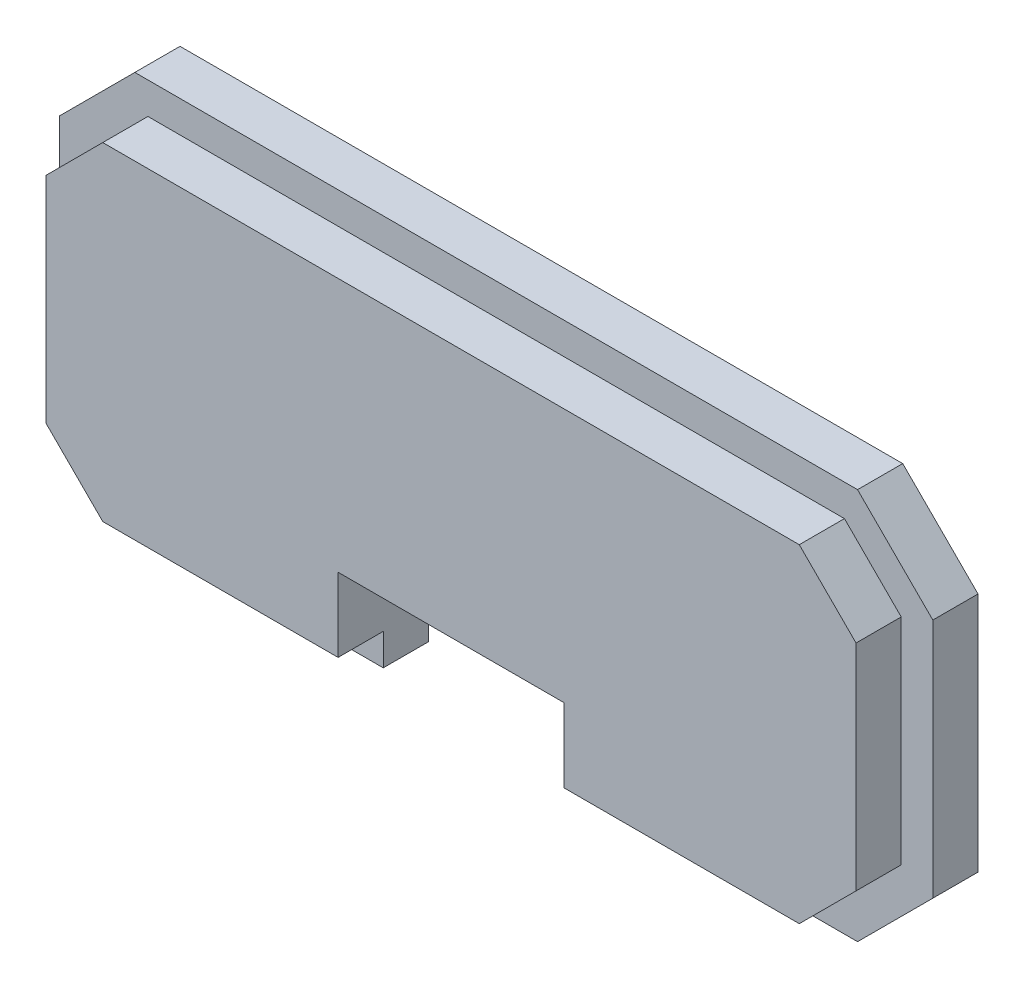
ISO-10303-21;
HEADER;
FILE_DESCRIPTION(('STEP AP214'),'2;1');
FILE_NAME('part.step','',(''),(''),'','','');
FILE_SCHEMA(('AUTOMOTIVE_DESIGN { 1 0 10303 214 1 1 1 1 }'));
ENDSEC;
DATA;
#1=APPLICATION_CONTEXT('core data for automotive mechanical design processes');
#2=APPLICATION_PROTOCOL_DEFINITION('international standard','automotive_design',2000,#1);
#3=PRODUCT_CONTEXT('',#1,'mechanical');
#4=PRODUCT('Part','Part','',(#3));
#5=PRODUCT_RELATED_PRODUCT_CATEGORY('part','',(#4));
#6=PRODUCT_DEFINITION_FORMATION('','',#4);
#7=PRODUCT_DEFINITION_CONTEXT('part definition',#1,'design');
#8=PRODUCT_DEFINITION('design','',#6,#7);
#9=PRODUCT_DEFINITION_SHAPE('','',#8);
#10=(LENGTH_UNIT() NAMED_UNIT(*) SI_UNIT(.MILLI.,.METRE.));
#11=(NAMED_UNIT(*) PLANE_ANGLE_UNIT() SI_UNIT($,.RADIAN.));
#12=(NAMED_UNIT(*) SI_UNIT($,.STERADIAN.) SOLID_ANGLE_UNIT());
#13=UNCERTAINTY_MEASURE_WITH_UNIT(LENGTH_MEASURE(1.E-05),#10,'distance_accuracy_value','');
#14=(GEOMETRIC_REPRESENTATION_CONTEXT(3) GLOBAL_UNCERTAINTY_ASSIGNED_CONTEXT((#13)) GLOBAL_UNIT_ASSIGNED_CONTEXT((#10,
#11,#12)) REPRESENTATION_CONTEXT('',''));
#15=CARTESIAN_POINT('',(0.,0.,0.));
#16=DIRECTION('',(0.,0.,1.));
#17=DIRECTION('',(1.,0.,0.));
#18=AXIS2_PLACEMENT_3D('',#15,#16,#17);
#19=CARTESIAN_POINT('',(-179.020441826215,80.6096612665685,3.));
#20=DIRECTION('',(0.,1.,0.));
#21=DIRECTION('',(0.,0.,1.));
#22=AXIS2_PLACEMENT_3D('',#19,#20,#21);
#23=PLANE('',#22);
#24=DIRECTION('',(0.,0.,-1.));
#25=VECTOR('',#24,1.);
#26=CARTESIAN_POINT('',(-210.520441826215,80.6096612665685,6.));
#27=LINE('',#26,#25);
#28=CARTESIAN_POINT('',(-210.520441826215,80.6096612665685,3.));
#29=VERTEX_POINT('',#28);
#30=CARTESIAN_POINT('',(-210.520441826215,80.6096612665685,0.));
#31=VERTEX_POINT('',#30);
#32=EDGE_CURVE('E226',#29,#31,#27,.T.);
#33=ORIENTED_EDGE('',*,*,#32,.F.);
#34=DIRECTION('',(1.,0.,0.));
#35=VECTOR('',#34,1.);
#36=CARTESIAN_POINT('',(-179.020441826215,80.6096612665685,3.));
#37=LINE('',#36,#35);
#38=CARTESIAN_POINT('',(-227.020441826215,80.6096612665685,3.));
#39=VERTEX_POINT('',#38);
#40=EDGE_CURVE('E308',#39,#29,#37,.T.);
#41=ORIENTED_EDGE('',*,*,#40,.F.);
#42=DIRECTION('',(0.,0.,-1.));
#43=VECTOR('',#42,1.);
#44=CARTESIAN_POINT('',(-227.020441826215,80.6096612665685,3.));
#45=LINE('',#44,#43);
#46=CARTESIAN_POINT('',(-227.020441826215,80.6096612665685,0.));
#47=VERTEX_POINT('',#46);
#48=EDGE_CURVE('E217',#39,#47,#45,.T.);
#49=ORIENTED_EDGE('',*,*,#48,.T.);
#50=DIRECTION('',(1.,0.,0.));
#51=VECTOR('',#50,1.);
#52=CARTESIAN_POINT('',(-179.020441826215,80.6096612665685,0.));
#53=LINE('',#52,#51);
#54=EDGE_CURVE('E324',#47,#31,#53,.T.);
#55=ORIENTED_EDGE('',*,*,#54,.T.);
#56=EDGE_LOOP('',(#33,#41,#49,#55));
#57=FACE_BOUND('',#56,.T.);
#58=ADVANCED_FACE('F43',(#57),#23,.F.);
#59=CARTESIAN_POINT('',(0.,0.,3.));
#60=DIRECTION('',(0.,0.,1.));
#61=DIRECTION('',(1.,0.,0.));
#62=AXIS2_PLACEMENT_3D('',#59,#60,#61);
#63=PLANE('',#62);
#64=ORIENTED_EDGE('',*,*,#40,.T.);
#65=DIRECTION('',(0.,1.,0.));
#66=VECTOR('',#65,1.);
#67=CARTESIAN_POINT('',(-210.520441826215,0.,3.));
#68=LINE('',#67,#66);
#69=CARTESIAN_POINT('',(-210.520441826215,82.7096612665685,3.));
#70=VERTEX_POINT('',#69);
#71=EDGE_CURVE('E235',#29,#70,#68,.T.);
#72=ORIENTED_EDGE('',*,*,#71,.T.);
#73=DIRECTION('',(1.,0.,0.));
#74=VECTOR('',#73,1.);
#75=CARTESIAN_POINT('',(-226.150593345232,82.7096612665685,3.));
#76=LINE('',#75,#74);
#77=CARTESIAN_POINT('',(-226.150593345232,82.7096612665685,3.));
#78=VERTEX_POINT('',#77);
#79=EDGE_CURVE('E238',#78,#70,#76,.T.);
#80=ORIENTED_EDGE('',*,*,#79,.F.);
#81=DIRECTION('',(0.707106781186546,-0.707106781186549,0.));
#82=VECTOR('',#81,1.);
#83=CARTESIAN_POINT('',(-229.920441826215,86.479509747552,3.));
#84=LINE('',#83,#82);
#85=CARTESIAN_POINT('',(-229.920441826215,86.479509747552,3.));
#86=VERTEX_POINT('',#85);
#87=EDGE_CURVE('E275',#86,#78,#84,.T.);
#88=ORIENTED_EDGE('',*,*,#87,.F.);
#89=DIRECTION('',(0.,-1.,0.));
#90=VECTOR('',#89,1.);
#91=CARTESIAN_POINT('',(-229.920441826215,100.739812785585,3.));
#92=LINE('',#91,#90);
#93=CARTESIAN_POINT('',(-229.920441826215,100.739812785585,3.));
#94=VERTEX_POINT('',#93);
#95=EDGE_CURVE('E267',#94,#86,#92,.T.);
#96=ORIENTED_EDGE('',*,*,#95,.F.);
#97=DIRECTION('',(-0.707106781186551,-0.707106781186544,0.));
#98=VECTOR('',#97,1.);
#99=CARTESIAN_POINT('',(-226.150593345231,104.509661266568,3.));
#100=LINE('',#99,#98);
#101=CARTESIAN_POINT('',(-226.150593345231,104.509661266568,3.));
#102=VERTEX_POINT('',#101);
#103=EDGE_CURVE('E266',#102,#94,#100,.T.);
#104=ORIENTED_EDGE('',*,*,#103,.F.);
#105=DIRECTION('',(-1.,0.,0.));
#106=VECTOR('',#105,1.);
#107=CARTESIAN_POINT('',(-179.890290307199,104.509661266568,3.));
#108=LINE('',#107,#106);
#109=CARTESIAN_POINT('',(-179.890290307199,104.509661266568,3.));
#110=VERTEX_POINT('',#109);
#111=EDGE_CURVE('E263',#110,#102,#108,.T.);
#112=ORIENTED_EDGE('',*,*,#111,.F.);
#113=DIRECTION('',(-0.707106781186545,0.70710678118655,0.));
#114=VECTOR('',#113,1.);
#115=CARTESIAN_POINT('',(-176.120441826215,100.739812785585,3.));
#116=LINE('',#115,#114);
#117=CARTESIAN_POINT('',(-176.120441826215,100.739812785585,3.));
#118=VERTEX_POINT('',#117);
#119=EDGE_CURVE('E257',#118,#110,#116,.T.);
#120=ORIENTED_EDGE('',*,*,#119,.F.);
#121=DIRECTION('',(0.,1.,0.));
#122=VECTOR('',#121,1.);
#123=CARTESIAN_POINT('',(-176.120441826215,86.479509747552,3.));
#124=LINE('',#123,#122);
#125=CARTESIAN_POINT('',(-176.120441826215,86.479509747552,3.));
#126=VERTEX_POINT('',#125);
#127=EDGE_CURVE('E260',#126,#118,#124,.T.);
#128=ORIENTED_EDGE('',*,*,#127,.F.);
#129=DIRECTION('',(0.707106781186549,0.707106781186546,0.));
#130=VECTOR('',#129,1.);
#131=CARTESIAN_POINT('',(-179.890290307199,82.7096612665685,3.));
#132=LINE('',#131,#130);
#133=CARTESIAN_POINT('',(-179.890290307199,82.7096612665685,3.));
#134=VERTEX_POINT('',#133);
#135=EDGE_CURVE('E234',#134,#126,#132,.T.);
#136=ORIENTED_EDGE('',*,*,#135,.F.);
#137=CARTESIAN_POINT('',(-195.520441826215,82.7096612665685,3.));
#138=VERTEX_POINT('',#137);
#139=EDGE_CURVE('E66',#138,#134,#76,.T.);
#140=ORIENTED_EDGE('',*,*,#139,.F.);
#141=DIRECTION('',(0.,-1.,0.));
#142=VECTOR('',#141,1.);
#143=CARTESIAN_POINT('',(-195.520441826215,0.,3.));
#144=LINE('',#143,#142);
#145=CARTESIAN_POINT('',(-195.520441826215,80.6096612665685,3.));
#146=VERTEX_POINT('',#145);
#147=EDGE_CURVE('E228',#138,#146,#144,.T.);
#148=ORIENTED_EDGE('',*,*,#147,.T.);
#149=CARTESIAN_POINT('',(-179.020441826215,80.6096612665685,3.));
#150=VERTEX_POINT('',#149);
#151=EDGE_CURVE('E302',#146,#150,#37,.T.);
#152=ORIENTED_EDGE('',*,*,#151,.T.);
#153=DIRECTION('',(0.707106781186551,0.707106781186545,0.));
#154=VECTOR('',#153,1.);
#155=CARTESIAN_POINT('',(-179.020441826215,80.6096612665685,3.));
#156=LINE('',#155,#154);
#157=CARTESIAN_POINT('',(-174.020441826215,85.6096612665685,3.));
#158=VERTEX_POINT('',#157);
#159=EDGE_CURVE('E310',#150,#158,#156,.T.);
#160=ORIENTED_EDGE('',*,*,#159,.T.);
#161=DIRECTION('',(0.,1.,0.));
#162=VECTOR('',#161,1.);
#163=CARTESIAN_POINT('',(-174.020441826215,101.609661266568,3.));
#164=LINE('',#163,#162);
#165=CARTESIAN_POINT('',(-174.020441826215,101.609661266568,3.));
#166=VERTEX_POINT('',#165);
#167=EDGE_CURVE('E313',#158,#166,#164,.T.);
#168=ORIENTED_EDGE('',*,*,#167,.T.);
#169=DIRECTION('',(-0.707106781186545,0.707106781186549,0.));
#170=VECTOR('',#169,1.);
#171=CARTESIAN_POINT('',(-174.020441826215,101.609661266568,3.));
#172=LINE('',#171,#170);
#173=CARTESIAN_POINT('',(-179.020441826215,106.609661266568,3.));
#174=VERTEX_POINT('',#173);
#175=EDGE_CURVE('E311',#166,#174,#172,.T.);
#176=ORIENTED_EDGE('',*,*,#175,.T.);
#177=DIRECTION('',(-1.,0.,0.));
#178=VECTOR('',#177,1.);
#179=CARTESIAN_POINT('',(-227.020441826215,106.609661266568,3.));
#180=LINE('',#179,#178);
#181=CARTESIAN_POINT('',(-227.020441826215,106.609661266568,3.));
#182=VERTEX_POINT('',#181);
#183=EDGE_CURVE('E312',#174,#182,#180,.T.);
#184=ORIENTED_EDGE('',*,*,#183,.T.);
#185=DIRECTION('',(-0.707106781186549,-0.707106781186545,0.));
#186=VECTOR('',#185,1.);
#187=CARTESIAN_POINT('',(-227.020441826215,106.609661266568,3.));
#188=LINE('',#187,#186);
#189=CARTESIAN_POINT('',(-232.020441826215,101.609661266568,3.));
#190=VERTEX_POINT('',#189);
#191=EDGE_CURVE('E320',#182,#190,#188,.T.);
#192=ORIENTED_EDGE('',*,*,#191,.T.);
#193=DIRECTION('',(0.,-1.,0.));
#194=VECTOR('',#193,1.);
#195=CARTESIAN_POINT('',(-232.020441826215,85.6096612665685,3.));
#196=LINE('',#195,#194);
#197=CARTESIAN_POINT('',(-232.020441826215,85.6096612665685,3.));
#198=VERTEX_POINT('',#197);
#199=EDGE_CURVE('E317',#190,#198,#196,.T.);
#200=ORIENTED_EDGE('',*,*,#199,.T.);
#201=DIRECTION('',(0.707106781186547,-0.707106781186549,0.));
#202=VECTOR('',#201,1.);
#203=CARTESIAN_POINT('',(-232.020441826215,85.6096612665685,3.));
#204=LINE('',#203,#202);
#205=EDGE_CURVE('E301',#198,#39,#204,.T.);
#206=ORIENTED_EDGE('',*,*,#205,.T.);
#207=EDGE_LOOP('',(#64,#72,#80,#88,#96,#104,#112,#120,#128,#136,#140,#148,#152,#160,#168,#176,
#184,#192,#200,#206));
#208=FACE_BOUND('',#207,.T.);
#209=ADVANCED_FACE('F392',(#208),#63,.T.);
#210=CARTESIAN_POINT('',(-226.150593345232,82.7096612665685,6.));
#211=DIRECTION('',(0.,1.,0.));
#212=DIRECTION('',(-1.,0.,0.));
#213=AXIS2_PLACEMENT_3D('',#210,#211,#212);
#214=PLANE('',#213);
#215=DIRECTION('',(0.,0.,-1.));
#216=VECTOR('',#215,1.);
#217=CARTESIAN_POINT('',(-210.520441826215,82.7096612665685,6.));
#218=LINE('',#217,#216);
#219=CARTESIAN_POINT('',(-210.520441826215,82.7096612665685,6.));
#220=VERTEX_POINT('',#219);
#221=EDGE_CURVE('E11',#220,#70,#218,.T.);
#222=ORIENTED_EDGE('',*,*,#221,.F.);
#223=DIRECTION('',(1.,0.,0.));
#224=VECTOR('',#223,1.);
#225=CARTESIAN_POINT('',(-226.150593345232,82.7096612665685,6.));
#226=LINE('',#225,#224);
#227=CARTESIAN_POINT('',(-226.150593345232,82.7096612665685,6.));
#228=VERTEX_POINT('',#227);
#229=EDGE_CURVE('E211',#228,#220,#226,.T.);
#230=ORIENTED_EDGE('',*,*,#229,.F.);
#231=DIRECTION('',(0.,0.,-1.));
#232=VECTOR('',#231,1.);
#233=CARTESIAN_POINT('',(-226.150593345232,82.7096612665685,6.));
#234=LINE('',#233,#232);
#235=EDGE_CURVE('E276',#228,#78,#234,.T.);
#236=ORIENTED_EDGE('',*,*,#235,.T.);
#237=ORIENTED_EDGE('',*,*,#79,.T.);
#238=EDGE_LOOP('',(#222,#230,#236,#237));
#239=FACE_BOUND('',#238,.T.);
#240=ADVANCED_FACE('F391',(#239),#214,.F.);
#241=DIRECTION('',(0.,0.,1.));
#242=VECTOR('',#241,1.);
#243=CARTESIAN_POINT('',(-195.520441826215,82.7096612665685,6.));
#244=LINE('',#243,#242);
#245=CARTESIAN_POINT('',(-195.520441826215,82.7096612665685,6.));
#246=VERTEX_POINT('',#245);
#247=EDGE_CURVE('E51',#138,#246,#244,.T.);
#248=ORIENTED_EDGE('',*,*,#247,.F.);
#249=ORIENTED_EDGE('',*,*,#139,.T.);
#250=DIRECTION('',(0.,0.,-1.));
#251=VECTOR('',#250,1.);
#252=CARTESIAN_POINT('',(-179.890290307199,82.7096612665685,6.));
#253=LINE('',#252,#251);
#254=CARTESIAN_POINT('',(-179.890290307199,82.7096612665685,6.));
#255=VERTEX_POINT('',#254);
#256=EDGE_CURVE('E255',#255,#134,#253,.T.);
#257=ORIENTED_EDGE('',*,*,#256,.F.);
#258=EDGE_CURVE('E252',#246,#255,#226,.T.);
#259=ORIENTED_EDGE('',*,*,#258,.F.);
#260=EDGE_LOOP('',(#248,#249,#257,#259));
#261=FACE_BOUND('',#260,.T.);
#262=ADVANCED_FACE('F361',(#261),#214,.F.);
#263=CARTESIAN_POINT('',(-232.020441826215,85.6096612665685,3.));
#264=DIRECTION('',(0.707106781186548,0.707106781186546,0.));
#265=DIRECTION('',(-0.707106781186547,0.707106781186549,0.));
#266=AXIS2_PLACEMENT_3D('',#263,#264,#265);
#267=PLANE('',#266);
#268=DIRECTION('',(0.707106781186547,-0.707106781186549,0.));
#269=VECTOR('',#268,1.);
#270=CARTESIAN_POINT('',(-232.020441826215,85.6096612665685,0.));
#271=LINE('',#270,#269);
#272=CARTESIAN_POINT('',(-232.020441826215,85.6096612665685,0.));
#273=VERTEX_POINT('',#272);
#274=EDGE_CURVE('E297',#273,#47,#271,.T.);
#275=ORIENTED_EDGE('',*,*,#274,.T.);
#276=ORIENTED_EDGE('',*,*,#48,.F.);
#277=ORIENTED_EDGE('',*,*,#205,.F.);
#278=DIRECTION('',(0.,0.,-1.));
#279=VECTOR('',#278,1.);
#280=CARTESIAN_POINT('',(-232.020441826215,85.6096612665685,3.));
#281=LINE('',#280,#279);
#282=EDGE_CURVE('E321',#198,#273,#281,.T.);
#283=ORIENTED_EDGE('',*,*,#282,.T.);
#284=EDGE_LOOP('',(#275,#276,#277,#283));
#285=FACE_BOUND('',#284,.T.);
#286=ADVANCED_FACE('F44',(#285),#267,.F.);
#287=ORIENTED_EDGE('',*,*,#151,.F.);
#288=DIRECTION('',(0.,0.,-1.));
#289=VECTOR('',#288,1.);
#290=CARTESIAN_POINT('',(-195.520441826215,80.6096612665685,6.));
#291=LINE('',#290,#289);
#292=CARTESIAN_POINT('',(-195.520441826215,80.6096612665685,0.));
#293=VERTEX_POINT('',#292);
#294=EDGE_CURVE('E221',#146,#293,#291,.T.);
#295=ORIENTED_EDGE('',*,*,#294,.T.);
#296=CARTESIAN_POINT('',(-179.020441826215,80.6096612665685,0.));
#297=VERTEX_POINT('',#296);
#298=EDGE_CURVE('E322',#293,#297,#53,.T.);
#299=ORIENTED_EDGE('',*,*,#298,.T.);
#300=DIRECTION('',(0.,0.,-1.));
#301=VECTOR('',#300,1.);
#302=CARTESIAN_POINT('',(-179.020441826215,80.6096612665685,3.));
#303=LINE('',#302,#301);
#304=EDGE_CURVE('E356',#150,#297,#303,.T.);
#305=ORIENTED_EDGE('',*,*,#304,.F.);
#306=EDGE_LOOP('',(#287,#295,#299,#305));
#307=FACE_BOUND('',#306,.T.);
#308=ADVANCED_FACE('F409',(#307),#23,.F.);
#309=CARTESIAN_POINT('',(-179.020441826215,80.6096612665685,3.));
#310=DIRECTION('',(-0.707106781186545,0.70710678118655,0.));
#311=DIRECTION('',(-0.70710678118655,-0.707106781186545,0.));
#312=AXIS2_PLACEMENT_3D('',#309,#310,#311);
#313=PLANE('',#312);
#314=DIRECTION('',(0.707106781186551,0.707106781186545,0.));
#315=VECTOR('',#314,1.);
#316=CARTESIAN_POINT('',(-179.020441826215,80.6096612665685,0.));
#317=LINE('',#316,#315);
#318=CARTESIAN_POINT('',(-174.020441826215,85.6096612665685,0.));
#319=VERTEX_POINT('',#318);
#320=EDGE_CURVE('E327',#297,#319,#317,.T.);
#321=ORIENTED_EDGE('',*,*,#320,.T.);
#322=DIRECTION('',(0.,0.,-1.));
#323=VECTOR('',#322,1.);
#324=CARTESIAN_POINT('',(-174.020441826215,85.6096612665685,3.));
#325=LINE('',#324,#323);
#326=EDGE_CURVE('E355',#158,#319,#325,.T.);
#327=ORIENTED_EDGE('',*,*,#326,.F.);
#328=ORIENTED_EDGE('',*,*,#159,.F.);
#329=ORIENTED_EDGE('',*,*,#304,.T.);
#330=EDGE_LOOP('',(#321,#327,#328,#329));
#331=FACE_BOUND('',#330,.T.);
#332=ADVANCED_FACE('F413',(#331),#313,.F.);
#333=CARTESIAN_POINT('',(-174.020441826215,101.609661266568,3.));
#334=DIRECTION('',(-1.,0.,0.));
#335=DIRECTION('',(0.,0.,1.));
#336=AXIS2_PLACEMENT_3D('',#333,#334,#335);
#337=PLANE('',#336);
#338=DIRECTION('',(0.,1.,0.));
#339=VECTOR('',#338,1.);
#340=CARTESIAN_POINT('',(-174.020441826215,101.609661266568,0.));
#341=LINE('',#340,#339);
#342=CARTESIAN_POINT('',(-174.020441826215,101.609661266568,0.));
#343=VERTEX_POINT('',#342);
#344=EDGE_CURVE('E329',#319,#343,#341,.T.);
#345=ORIENTED_EDGE('',*,*,#344,.T.);
#346=DIRECTION('',(0.,0.,-1.));
#347=VECTOR('',#346,1.);
#348=CARTESIAN_POINT('',(-174.020441826215,101.609661266568,3.));
#349=LINE('',#348,#347);
#350=EDGE_CURVE('E348',#166,#343,#349,.T.);
#351=ORIENTED_EDGE('',*,*,#350,.F.);
#352=ORIENTED_EDGE('',*,*,#167,.F.);
#353=ORIENTED_EDGE('',*,*,#326,.T.);
#354=EDGE_LOOP('',(#345,#351,#352,#353));
#355=FACE_BOUND('',#354,.T.);
#356=ADVANCED_FACE('F418',(#355),#337,.F.);
#357=CARTESIAN_POINT('',(-174.020441826215,101.609661266568,3.));
#358=DIRECTION('',(-0.707106781186549,-0.707106781186546,0.));
#359=DIRECTION('',(0.707106781186546,-0.707106781186549,0.));
#360=AXIS2_PLACEMENT_3D('',#357,#358,#359);
#361=PLANE('',#360);
#362=DIRECTION('',(-0.707106781186545,0.707106781186549,0.));
#363=VECTOR('',#362,1.);
#364=CARTESIAN_POINT('',(-174.020441826215,101.609661266568,0.));
#365=LINE('',#364,#363);
#366=CARTESIAN_POINT('',(-179.020441826215,106.609661266568,0.));
#367=VERTEX_POINT('',#366);
#368=EDGE_CURVE('E335',#343,#367,#365,.T.);
#369=ORIENTED_EDGE('',*,*,#368,.T.);
#370=DIRECTION('',(0.,0.,-1.));
#371=VECTOR('',#370,1.);
#372=CARTESIAN_POINT('',(-179.020441826215,106.609661266568,3.));
#373=LINE('',#372,#371);
#374=EDGE_CURVE('E350',#174,#367,#373,.T.);
#375=ORIENTED_EDGE('',*,*,#374,.F.);
#376=ORIENTED_EDGE('',*,*,#175,.F.);
#377=ORIENTED_EDGE('',*,*,#350,.T.);
#378=EDGE_LOOP('',(#369,#375,#376,#377));
#379=FACE_BOUND('',#378,.T.);
#380=ADVANCED_FACE('F423',(#379),#361,.F.);
#381=CARTESIAN_POINT('',(-227.020441826215,106.609661266568,3.));
#382=DIRECTION('',(0.,-1.,0.));
#383=DIRECTION('',(0.,0.,-1.));
#384=AXIS2_PLACEMENT_3D('',#381,#382,#383);
#385=PLANE('',#384);
#386=DIRECTION('',(-1.,0.,0.));
#387=VECTOR('',#386,1.);
#388=CARTESIAN_POINT('',(-227.020441826215,106.609661266568,0.));
#389=LINE('',#388,#387);
#390=CARTESIAN_POINT('',(-227.020441826215,106.609661266568,0.));
#391=VERTEX_POINT('',#390);
#392=EDGE_CURVE('E331',#367,#391,#389,.T.);
#393=ORIENTED_EDGE('',*,*,#392,.T.);
#394=DIRECTION('',(0.,0.,-1.));
#395=VECTOR('',#394,1.);
#396=CARTESIAN_POINT('',(-227.020441826215,106.609661266568,3.));
#397=LINE('',#396,#395);
#398=EDGE_CURVE('E342',#182,#391,#397,.T.);
#399=ORIENTED_EDGE('',*,*,#398,.F.);
#400=ORIENTED_EDGE('',*,*,#183,.F.);
#401=ORIENTED_EDGE('',*,*,#374,.T.);
#402=EDGE_LOOP('',(#393,#399,#400,#401));
#403=FACE_BOUND('',#402,.T.);
#404=ADVANCED_FACE('F430',(#403),#385,.F.);
#405=CARTESIAN_POINT('',(-227.020441826215,106.609661266568,3.));
#406=DIRECTION('',(0.707106781186546,-0.707106781186549,0.));
#407=DIRECTION('',(0.707106781186549,0.707106781186546,0.));
#408=AXIS2_PLACEMENT_3D('',#405,#406,#407);
#409=PLANE('',#408);
#410=DIRECTION('',(-0.707106781186549,-0.707106781186545,0.));
#411=VECTOR('',#410,1.);
#412=CARTESIAN_POINT('',(-227.020441826215,106.609661266568,0.));
#413=LINE('',#412,#411);
#414=CARTESIAN_POINT('',(-232.020441826215,101.609661266568,0.));
#415=VERTEX_POINT('',#414);
#416=EDGE_CURVE('E339',#391,#415,#413,.T.);
#417=ORIENTED_EDGE('',*,*,#416,.T.);
#418=DIRECTION('',(0.,0.,-1.));
#419=VECTOR('',#418,1.);
#420=CARTESIAN_POINT('',(-232.020441826215,101.609661266568,3.));
#421=LINE('',#420,#419);
#422=EDGE_CURVE('E341',#190,#415,#421,.T.);
#423=ORIENTED_EDGE('',*,*,#422,.F.);
#424=ORIENTED_EDGE('',*,*,#191,.F.);
#425=ORIENTED_EDGE('',*,*,#398,.T.);
#426=EDGE_LOOP('',(#417,#423,#424,#425));
#427=FACE_BOUND('',#426,.T.);
#428=ADVANCED_FACE('F431',(#427),#409,.F.);
#429=CARTESIAN_POINT('',(-232.020441826215,85.6096612665685,3.));
#430=DIRECTION('',(1.,0.,0.));
#431=DIRECTION('',(0.,0.,-1.));
#432=AXIS2_PLACEMENT_3D('',#429,#430,#431);
#433=PLANE('',#432);
#434=DIRECTION('',(0.,-1.,0.));
#435=VECTOR('',#434,1.);
#436=CARTESIAN_POINT('',(-232.020441826215,85.6096612665685,0.));
#437=LINE('',#436,#435);
#438=EDGE_CURVE('E304',#415,#273,#437,.T.);
#439=ORIENTED_EDGE('',*,*,#438,.T.);
#440=ORIENTED_EDGE('',*,*,#282,.F.);
#441=ORIENTED_EDGE('',*,*,#199,.F.);
#442=ORIENTED_EDGE('',*,*,#422,.T.);
#443=EDGE_LOOP('',(#439,#440,#441,#442));
#444=FACE_BOUND('',#443,.T.);
#445=ADVANCED_FACE('F436',(#444),#433,.F.);
#446=CARTESIAN_POINT('',(0.,0.,0.));
#447=DIRECTION('',(0.,0.,1.));
#448=DIRECTION('',(1.,0.,0.));
#449=AXIS2_PLACEMENT_3D('',#446,#447,#448);
#450=PLANE('',#449);
#451=DIRECTION('',(-1.,0.,0.));
#452=VECTOR('',#451,1.);
#453=CARTESIAN_POINT('',(-210.520441826215,87.6096612665685,0.));
#454=LINE('',#453,#452);
#455=CARTESIAN_POINT('',(-195.520441826215,87.6096612665685,0.));
#456=VERTEX_POINT('',#455);
#457=CARTESIAN_POINT('',(-210.520441826215,87.6096612665685,0.));
#458=VERTEX_POINT('',#457);
#459=EDGE_CURVE('E215',#456,#458,#454,.T.);
#460=ORIENTED_EDGE('',*,*,#459,.T.);
#461=DIRECTION('',(0.,-1.,0.));
#462=VECTOR('',#461,1.);
#463=CARTESIAN_POINT('',(-210.520441826215,80.6096612665685,0.));
#464=LINE('',#463,#462);
#465=EDGE_CURVE('E202',#458,#31,#464,.T.);
#466=ORIENTED_EDGE('',*,*,#465,.T.);
#467=ORIENTED_EDGE('',*,*,#54,.F.);
#468=ORIENTED_EDGE('',*,*,#274,.F.);
#469=ORIENTED_EDGE('',*,*,#438,.F.);
#470=ORIENTED_EDGE('',*,*,#416,.F.);
#471=ORIENTED_EDGE('',*,*,#392,.F.);
#472=ORIENTED_EDGE('',*,*,#368,.F.);
#473=ORIENTED_EDGE('',*,*,#344,.F.);
#474=ORIENTED_EDGE('',*,*,#320,.F.);
#475=ORIENTED_EDGE('',*,*,#298,.F.);
#476=DIRECTION('',(0.,1.,0.));
#477=VECTOR('',#476,1.);
#478=CARTESIAN_POINT('',(-195.520441826215,80.6096612665685,0.));
#479=LINE('',#478,#477);
#480=EDGE_CURVE('E212',#293,#456,#479,.T.);
#481=ORIENTED_EDGE('',*,*,#480,.T.);
#482=EDGE_LOOP('',(#460,#466,#467,#468,#469,#470,#471,#472,#473,#474,#475,#481));
#483=FACE_BOUND('',#482,.T.);
#484=ADVANCED_FACE('F399',(#483),#450,.F.);
#485=CARTESIAN_POINT('',(-179.890290307199,82.7096612665685,6.));
#486=DIRECTION('',(-0.707106781186546,0.707106781186549,0.));
#487=DIRECTION('',(-0.707106781186549,-0.707106781186546,0.));
#488=AXIS2_PLACEMENT_3D('',#485,#486,#487);
#489=PLANE('',#488);
#490=ORIENTED_EDGE('',*,*,#135,.T.);
#491=DIRECTION('',(0.,0.,-1.));
#492=VECTOR('',#491,1.);
#493=CARTESIAN_POINT('',(-176.120441826215,86.479509747552,6.));
#494=LINE('',#493,#492);
#495=CARTESIAN_POINT('',(-176.120441826215,86.479509747552,6.));
#496=VERTEX_POINT('',#495);
#497=EDGE_CURVE('E296',#496,#126,#494,.T.);
#498=ORIENTED_EDGE('',*,*,#497,.F.);
#499=DIRECTION('',(0.707106781186549,0.707106781186546,0.));
#500=VECTOR('',#499,1.);
#501=CARTESIAN_POINT('',(-179.890290307199,82.7096612665685,6.));
#502=LINE('',#501,#500);
#503=EDGE_CURVE('E237',#255,#496,#502,.T.);
#504=ORIENTED_EDGE('',*,*,#503,.F.);
#505=ORIENTED_EDGE('',*,*,#256,.T.);
#506=EDGE_LOOP('',(#490,#498,#504,#505));
#507=FACE_BOUND('',#506,.T.);
#508=ADVANCED_FACE('F370',(#507),#489,.F.);
#509=CARTESIAN_POINT('',(-176.120441826215,86.479509747552,6.));
#510=DIRECTION('',(-1.,0.,0.));
#511=DIRECTION('',(0.,0.,1.));
#512=AXIS2_PLACEMENT_3D('',#509,#510,#511);
#513=PLANE('',#512);
#514=ORIENTED_EDGE('',*,*,#127,.T.);
#515=DIRECTION('',(0.,0.,-1.));
#516=VECTOR('',#515,1.);
#517=CARTESIAN_POINT('',(-176.120441826215,100.739812785585,6.));
#518=LINE('',#517,#516);
#519=CARTESIAN_POINT('',(-176.120441826215,100.739812785585,6.));
#520=VERTEX_POINT('',#519);
#521=EDGE_CURVE('E294',#520,#118,#518,.T.);
#522=ORIENTED_EDGE('',*,*,#521,.F.);
#523=DIRECTION('',(0.,1.,0.));
#524=VECTOR('',#523,1.);
#525=CARTESIAN_POINT('',(-176.120441826215,86.479509747552,6.));
#526=LINE('',#525,#524);
#527=EDGE_CURVE('E239',#496,#520,#526,.T.);
#528=ORIENTED_EDGE('',*,*,#527,.F.);
#529=ORIENTED_EDGE('',*,*,#497,.T.);
#530=EDGE_LOOP('',(#514,#522,#528,#529));
#531=FACE_BOUND('',#530,.T.);
#532=ADVANCED_FACE('F375',(#531),#513,.F.);
#533=CARTESIAN_POINT('',(-176.120441826215,100.739812785585,6.));
#534=DIRECTION('',(-0.70710678118655,-0.707106781186545,0.));
#535=DIRECTION('',(0.707106781186545,-0.70710678118655,0.));
#536=AXIS2_PLACEMENT_3D('',#533,#534,#535);
#537=PLANE('',#536);
#538=ORIENTED_EDGE('',*,*,#119,.T.);
#539=DIRECTION('',(0.,0.,-1.));
#540=VECTOR('',#539,1.);
#541=CARTESIAN_POINT('',(-179.890290307199,104.509661266568,6.));
#542=LINE('',#541,#540);
#543=CARTESIAN_POINT('',(-179.890290307199,104.509661266568,6.));
#544=VERTEX_POINT('',#543);
#545=EDGE_CURVE('E292',#544,#110,#542,.T.);
#546=ORIENTED_EDGE('',*,*,#545,.F.);
#547=DIRECTION('',(-0.707106781186545,0.70710678118655,0.));
#548=VECTOR('',#547,1.);
#549=CARTESIAN_POINT('',(-176.120441826215,100.739812785585,6.));
#550=LINE('',#549,#548);
#551=EDGE_CURVE('E241',#520,#544,#550,.T.);
#552=ORIENTED_EDGE('',*,*,#551,.F.);
#553=ORIENTED_EDGE('',*,*,#521,.T.);
#554=EDGE_LOOP('',(#538,#546,#552,#553));
#555=FACE_BOUND('',#554,.T.);
#556=ADVANCED_FACE('F372',(#555),#537,.F.);
#557=CARTESIAN_POINT('',(-179.890290307199,104.509661266568,6.));
#558=DIRECTION('',(0.,-1.,0.));
#559=DIRECTION('',(0.,0.,-1.));
#560=AXIS2_PLACEMENT_3D('',#557,#558,#559);
#561=PLANE('',#560);
#562=ORIENTED_EDGE('',*,*,#111,.T.);
#563=DIRECTION('',(0.,0.,-1.));
#564=VECTOR('',#563,1.);
#565=CARTESIAN_POINT('',(-226.150593345231,104.509661266568,6.));
#566=LINE('',#565,#564);
#567=CARTESIAN_POINT('',(-226.150593345231,104.509661266568,6.));
#568=VERTEX_POINT('',#567);
#569=EDGE_CURVE('E288',#568,#102,#566,.T.);
#570=ORIENTED_EDGE('',*,*,#569,.F.);
#571=DIRECTION('',(-1.,0.,0.));
#572=VECTOR('',#571,1.);
#573=CARTESIAN_POINT('',(-179.890290307199,104.509661266568,6.));
#574=LINE('',#573,#572);
#575=EDGE_CURVE('E243',#544,#568,#574,.T.);
#576=ORIENTED_EDGE('',*,*,#575,.F.);
#577=ORIENTED_EDGE('',*,*,#545,.T.);
#578=EDGE_LOOP('',(#562,#570,#576,#577));
#579=FACE_BOUND('',#578,.T.);
#580=ADVANCED_FACE('F378',(#579),#561,.F.);
#581=CARTESIAN_POINT('',(-226.150593345231,104.509661266568,6.));
#582=DIRECTION('',(0.707106781186544,-0.707106781186551,0.));
#583=DIRECTION('',(0.707106781186551,0.707106781186544,0.));
#584=AXIS2_PLACEMENT_3D('',#581,#582,#583);
#585=PLANE('',#584);
#586=ORIENTED_EDGE('',*,*,#103,.T.);
#587=DIRECTION('',(0.,0.,-1.));
#588=VECTOR('',#587,1.);
#589=CARTESIAN_POINT('',(-229.920441826215,100.739812785585,6.));
#590=LINE('',#589,#588);
#591=CARTESIAN_POINT('',(-229.920441826215,100.739812785585,6.));
#592=VERTEX_POINT('',#591);
#593=EDGE_CURVE('E282',#592,#94,#590,.T.);
#594=ORIENTED_EDGE('',*,*,#593,.F.);
#595=DIRECTION('',(-0.707106781186551,-0.707106781186544,0.));
#596=VECTOR('',#595,1.);
#597=CARTESIAN_POINT('',(-226.150593345231,104.509661266568,6.));
#598=LINE('',#597,#596);
#599=EDGE_CURVE('E246',#568,#592,#598,.T.);
#600=ORIENTED_EDGE('',*,*,#599,.F.);
#601=ORIENTED_EDGE('',*,*,#569,.T.);
#602=EDGE_LOOP('',(#586,#594,#600,#601));
#603=FACE_BOUND('',#602,.T.);
#604=ADVANCED_FACE('F383',(#603),#585,.F.);
#605=CARTESIAN_POINT('',(-229.920441826215,100.739812785585,6.));
#606=DIRECTION('',(1.,0.,0.));
#607=DIRECTION('',(0.,0.,-1.));
#608=AXIS2_PLACEMENT_3D('',#605,#606,#607);
#609=PLANE('',#608);
#610=ORIENTED_EDGE('',*,*,#95,.T.);
#611=DIRECTION('',(0.,0.,-1.));
#612=VECTOR('',#611,1.);
#613=CARTESIAN_POINT('',(-229.920441826215,86.479509747552,6.));
#614=LINE('',#613,#612);
#615=CARTESIAN_POINT('',(-229.920441826215,86.479509747552,6.));
#616=VERTEX_POINT('',#615);
#617=EDGE_CURVE('E281',#616,#86,#614,.T.);
#618=ORIENTED_EDGE('',*,*,#617,.F.);
#619=DIRECTION('',(0.,-1.,0.));
#620=VECTOR('',#619,1.);
#621=CARTESIAN_POINT('',(-229.920441826215,100.739812785585,6.));
#622=LINE('',#621,#620);
#623=EDGE_CURVE('E248',#592,#616,#622,.T.);
#624=ORIENTED_EDGE('',*,*,#623,.F.);
#625=ORIENTED_EDGE('',*,*,#593,.T.);
#626=EDGE_LOOP('',(#610,#618,#624,#625));
#627=FACE_BOUND('',#626,.T.);
#628=ADVANCED_FACE('F387',(#627),#609,.F.);
#629=CARTESIAN_POINT('',(-229.920441826215,86.479509747552,6.));
#630=DIRECTION('',(0.707106781186549,0.707106781186546,0.));
#631=DIRECTION('',(-0.707106781186546,0.707106781186549,0.));
#632=AXIS2_PLACEMENT_3D('',#629,#630,#631);
#633=PLANE('',#632);
#634=ORIENTED_EDGE('',*,*,#87,.T.);
#635=ORIENTED_EDGE('',*,*,#235,.F.);
#636=DIRECTION('',(0.707106781186546,-0.707106781186549,0.));
#637=VECTOR('',#636,1.);
#638=CARTESIAN_POINT('',(-229.920441826215,86.479509747552,6.));
#639=LINE('',#638,#637);
#640=EDGE_CURVE('E249',#616,#228,#639,.T.);
#641=ORIENTED_EDGE('',*,*,#640,.F.);
#642=ORIENTED_EDGE('',*,*,#617,.T.);
#643=EDGE_LOOP('',(#634,#635,#641,#642));
#644=FACE_BOUND('',#643,.T.);
#645=ADVANCED_FACE('F388',(#644),#633,.F.);
#646=CARTESIAN_POINT('',(0.,0.,6.));
#647=DIRECTION('',(0.,0.,1.));
#648=DIRECTION('',(1.,0.,0.));
#649=AXIS2_PLACEMENT_3D('',#646,#647,#648);
#650=PLANE('',#649);
#651=DIRECTION('',(0.,-1.,0.));
#652=VECTOR('',#651,1.);
#653=CARTESIAN_POINT('',(-210.520441826215,80.6096612665685,6.));
#654=LINE('',#653,#652);
#655=CARTESIAN_POINT('',(-210.520441826215,87.6096612665685,6.));
#656=VERTEX_POINT('',#655);
#657=EDGE_CURVE('E200',#656,#220,#654,.T.);
#658=ORIENTED_EDGE('',*,*,#657,.F.);
#659=DIRECTION('',(-1.,0.,0.));
#660=VECTOR('',#659,1.);
#661=CARTESIAN_POINT('',(-210.520441826215,87.6096612665685,6.));
#662=LINE('',#661,#660);
#663=CARTESIAN_POINT('',(-195.520441826215,87.6096612665685,6.));
#664=VERTEX_POINT('',#663);
#665=EDGE_CURVE('E191',#664,#656,#662,.T.);
#666=ORIENTED_EDGE('',*,*,#665,.F.);
#667=DIRECTION('',(0.,1.,0.));
#668=VECTOR('',#667,1.);
#669=CARTESIAN_POINT('',(-195.520441826215,80.6096612665685,6.));
#670=LINE('',#669,#668);
#671=EDGE_CURVE('E220',#246,#664,#670,.T.);
#672=ORIENTED_EDGE('',*,*,#671,.F.);
#673=ORIENTED_EDGE('',*,*,#258,.T.);
#674=ORIENTED_EDGE('',*,*,#503,.T.);
#675=ORIENTED_EDGE('',*,*,#527,.T.);
#676=ORIENTED_EDGE('',*,*,#551,.T.);
#677=ORIENTED_EDGE('',*,*,#575,.T.);
#678=ORIENTED_EDGE('',*,*,#599,.T.);
#679=ORIENTED_EDGE('',*,*,#623,.T.);
#680=ORIENTED_EDGE('',*,*,#640,.T.);
#681=ORIENTED_EDGE('',*,*,#229,.T.);
#682=EDGE_LOOP('',(#658,#666,#672,#673,#674,#675,#676,#677,#678,#679,#680,#681));
#683=FACE_BOUND('',#682,.T.);
#684=ADVANCED_FACE('F207',(#683),#650,.T.);
#685=CARTESIAN_POINT('',(-210.520441826215,80.6096612665685,6.));
#686=DIRECTION('',(1.,0.,0.));
#687=DIRECTION('',(0.,0.,-1.));
#688=AXIS2_PLACEMENT_3D('',#685,#686,#687);
#689=PLANE('',#688);
#690=ORIENTED_EDGE('',*,*,#32,.T.);
#691=ORIENTED_EDGE('',*,*,#465,.F.);
#692=DIRECTION('',(0.,0.,-1.));
#693=VECTOR('',#692,1.);
#694=CARTESIAN_POINT('',(-210.520441826215,87.6096612665685,6.));
#695=LINE('',#694,#693);
#696=EDGE_CURVE('E192',#656,#458,#695,.T.);
#697=ORIENTED_EDGE('',*,*,#696,.F.);
#698=ORIENTED_EDGE('',*,*,#657,.T.);
#699=ORIENTED_EDGE('',*,*,#221,.T.);
#700=ORIENTED_EDGE('',*,*,#71,.F.);
#701=EDGE_LOOP('',(#690,#691,#697,#698,#699,#700));
#702=FACE_BOUND('',#701,.T.);
#703=ADVANCED_FACE('F205',(#702),#689,.T.);
#704=CARTESIAN_POINT('',(-195.520441826215,80.6096612665685,6.));
#705=DIRECTION('',(-1.,0.,0.));
#706=DIRECTION('',(0.,0.,1.));
#707=AXIS2_PLACEMENT_3D('',#704,#705,#706);
#708=PLANE('',#707);
#709=ORIENTED_EDGE('',*,*,#247,.T.);
#710=ORIENTED_EDGE('',*,*,#671,.T.);
#711=DIRECTION('',(0.,0.,-1.));
#712=VECTOR('',#711,1.);
#713=CARTESIAN_POINT('',(-195.520441826215,87.6096612665685,6.));
#714=LINE('',#713,#712);
#715=EDGE_CURVE('E59',#664,#456,#714,.T.);
#716=ORIENTED_EDGE('',*,*,#715,.T.);
#717=ORIENTED_EDGE('',*,*,#480,.F.);
#718=ORIENTED_EDGE('',*,*,#294,.F.);
#719=ORIENTED_EDGE('',*,*,#147,.F.);
#720=EDGE_LOOP('',(#709,#710,#716,#717,#718,#719));
#721=FACE_BOUND('',#720,.T.);
#722=ADVANCED_FACE('F363',(#721),#708,.T.);
#723=CARTESIAN_POINT('',(-210.520441826215,87.6096612665685,6.));
#724=DIRECTION('',(0.,-1.,0.));
#725=DIRECTION('',(0.,0.,-1.));
#726=AXIS2_PLACEMENT_3D('',#723,#724,#725);
#727=PLANE('',#726);
#728=ORIENTED_EDGE('',*,*,#459,.F.);
#729=ORIENTED_EDGE('',*,*,#715,.F.);
#730=ORIENTED_EDGE('',*,*,#665,.T.);
#731=ORIENTED_EDGE('',*,*,#696,.T.);
#732=EDGE_LOOP('',(#728,#729,#730,#731));
#733=FACE_BOUND('',#732,.T.);
#734=ADVANCED_FACE('F193',(#733),#727,.T.);
#735=CLOSED_SHELL('',(#58,#209,#240,#262,#286,#308,#332,#356,#380,#404,#428,#445,#484,#508,#532,
#556,#580,#604,#628,#645,#684,#703,#722,#734));
#736=MANIFOLD_SOLID_BREP('B2',#735);
#737=ADVANCED_BREP_SHAPE_REPRESENTATION('',(#18,#736),#14);
#738=SHAPE_DEFINITION_REPRESENTATION(#9,#737);
ENDSEC;
END-ISO-10303-21;
